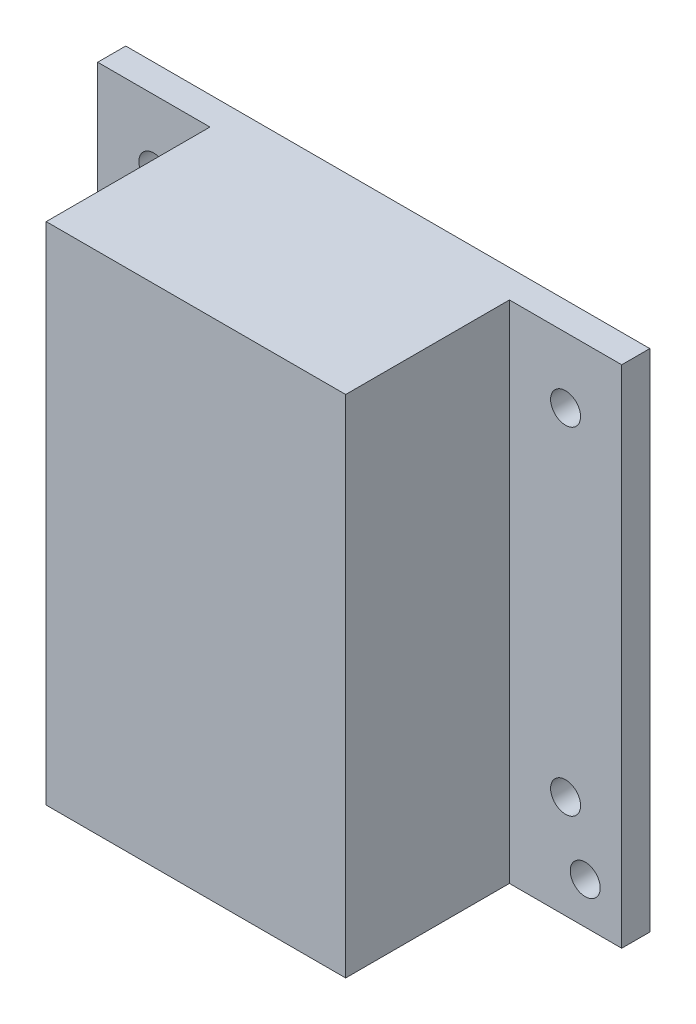
ISO-10303-21;
HEADER;
FILE_DESCRIPTION(('STEP AP214'),'2;1');
FILE_NAME('part.step','',(''),(''),'','','');
FILE_SCHEMA(('AUTOMOTIVE_DESIGN { 1 0 10303 214 1 1 1 1 }'));
ENDSEC;
DATA;
#1=APPLICATION_CONTEXT('core data for automotive mechanical design processes');
#2=APPLICATION_PROTOCOL_DEFINITION('international standard','automotive_design',2000,#1);
#3=PRODUCT_CONTEXT('',#1,'mechanical');
#4=PRODUCT('Part','Part','',(#3));
#5=PRODUCT_RELATED_PRODUCT_CATEGORY('part','',(#4));
#6=PRODUCT_DEFINITION_FORMATION('','',#4);
#7=PRODUCT_DEFINITION_CONTEXT('part definition',#1,'design');
#8=PRODUCT_DEFINITION('design','',#6,#7);
#9=PRODUCT_DEFINITION_SHAPE('','',#8);
#10=(LENGTH_UNIT() NAMED_UNIT(*) SI_UNIT(.MILLI.,.METRE.));
#11=(NAMED_UNIT(*) PLANE_ANGLE_UNIT() SI_UNIT($,.RADIAN.));
#12=(NAMED_UNIT(*) SI_UNIT($,.STERADIAN.) SOLID_ANGLE_UNIT());
#13=UNCERTAINTY_MEASURE_WITH_UNIT(LENGTH_MEASURE(1.E-05),#10,'distance_accuracy_value','');
#14=(GEOMETRIC_REPRESENTATION_CONTEXT(3) GLOBAL_UNCERTAINTY_ASSIGNED_CONTEXT((#13)) GLOBAL_UNIT_ASSIGNED_CONTEXT((#10,
#11,#12)) REPRESENTATION_CONTEXT('',''));
#15=CARTESIAN_POINT('',(0.,0.,0.));
#16=DIRECTION('',(0.,0.,1.));
#17=DIRECTION('',(1.,0.,0.));
#18=AXIS2_PLACEMENT_3D('',#15,#16,#17);
#19=CARTESIAN_POINT('',(16.,-80.,23.5));
#20=DIRECTION('',(-1.,0.,0.));
#21=DIRECTION('',(0.,0.,1.));
#22=AXIS2_PLACEMENT_3D('',#19,#20,#21);
#23=PLANE('',#22);
#24=DIRECTION('',(0.,0.,-1.));
#25=VECTOR('',#24,1.);
#26=CARTESIAN_POINT('',(16.,-80.,23.5));
#27=LINE('',#26,#25);
#28=CARTESIAN_POINT('',(16.,-80.,26.5));
#29=VERTEX_POINT('',#28);
#30=CARTESIAN_POINT('',(16.,-80.,9.));
#31=VERTEX_POINT('',#30);
#32=EDGE_CURVE('E231',#29,#31,#27,.T.);
#33=ORIENTED_EDGE('',*,*,#32,.T.);
#34=DIRECTION('',(0.,-1.,0.));
#35=VECTOR('',#34,1.);
#36=CARTESIAN_POINT('',(16.,-26.,9.));
#37=LINE('',#36,#35);
#38=CARTESIAN_POINT('',(16.,-26.,9.));
#39=VERTEX_POINT('',#38);
#40=EDGE_CURVE('E143',#39,#31,#37,.T.);
#41=ORIENTED_EDGE('',*,*,#40,.F.);
#42=DIRECTION('',(0.,0.,-1.));
#43=VECTOR('',#42,1.);
#44=CARTESIAN_POINT('',(16.,-26.,23.5));
#45=LINE('',#44,#43);
#46=CARTESIAN_POINT('',(16.,-26.,26.5));
#47=VERTEX_POINT('',#46);
#48=EDGE_CURVE('E111',#47,#39,#45,.T.);
#49=ORIENTED_EDGE('',*,*,#48,.F.);
#50=DIRECTION('',(0.,1.,0.));
#51=VECTOR('',#50,1.);
#52=CARTESIAN_POINT('',(16.,-26.,26.5));
#53=LINE('',#52,#51);
#54=EDGE_CURVE('E306',#29,#47,#53,.T.);
#55=ORIENTED_EDGE('',*,*,#54,.F.);
#56=EDGE_LOOP('',(#33,#41,#49,#55));
#57=FACE_BOUND('',#56,.T.);
#58=ADVANCED_FACE('F32',(#57),#23,.F.);
#59=CARTESIAN_POINT('',(0.,0.,26.5));
#60=DIRECTION('',(0.,0.,1.));
#61=DIRECTION('',(1.,0.,0.));
#62=AXIS2_PLACEMENT_3D('',#59,#60,#61);
#63=PLANE('',#62);
#64=DIRECTION('',(0.,-1.,0.));
#65=VECTOR('',#64,1.);
#66=CARTESIAN_POINT('',(-16.,-26.,26.5));
#67=LINE('',#66,#65);
#68=CARTESIAN_POINT('',(-16.,-26.,26.5));
#69=VERTEX_POINT('',#68);
#70=CARTESIAN_POINT('',(-16.,-80.,26.5));
#71=VERTEX_POINT('',#70);
#72=EDGE_CURVE('E234',#69,#71,#67,.T.);
#73=ORIENTED_EDGE('',*,*,#72,.T.);
#74=DIRECTION('',(1.,0.,0.));
#75=VECTOR('',#74,1.);
#76=CARTESIAN_POINT('',(-16.,-80.,26.5));
#77=LINE('',#76,#75);
#78=EDGE_CURVE('E221',#71,#29,#77,.T.);
#79=ORIENTED_EDGE('',*,*,#78,.T.);
#80=ORIENTED_EDGE('',*,*,#54,.T.);
#81=DIRECTION('',(-1.,0.,0.));
#82=VECTOR('',#81,1.);
#83=CARTESIAN_POINT('',(-16.,-26.,26.5));
#84=LINE('',#83,#82);
#85=EDGE_CURVE('E240',#47,#69,#84,.T.);
#86=ORIENTED_EDGE('',*,*,#85,.T.);
#87=EDGE_LOOP('',(#73,#79,#80,#86));
#88=FACE_BOUND('',#87,.T.);
#89=ADVANCED_FACE('F378',(#88),#63,.T.);
#90=CARTESIAN_POINT('',(-16.,-80.,23.5));
#91=DIRECTION('',(1.,0.,0.));
#92=DIRECTION('',(0.,0.,-1.));
#93=AXIS2_PLACEMENT_3D('',#90,#91,#92);
#94=PLANE('',#93);
#95=DIRECTION('',(0.,1.,0.));
#96=VECTOR('',#95,1.);
#97=CARTESIAN_POINT('',(-16.,-26.,9.));
#98=LINE('',#97,#96);
#99=CARTESIAN_POINT('',(-16.,-80.,9.));
#100=VERTEX_POINT('',#99);
#101=CARTESIAN_POINT('',(-16.,-26.,9.));
#102=VERTEX_POINT('',#101);
#103=EDGE_CURVE('E124',#100,#102,#98,.T.);
#104=ORIENTED_EDGE('',*,*,#103,.F.);
#105=DIRECTION('',(0.,0.,-1.));
#106=VECTOR('',#105,1.);
#107=CARTESIAN_POINT('',(-16.,-80.,23.5));
#108=LINE('',#107,#106);
#109=EDGE_CURVE('E164',#71,#100,#108,.T.);
#110=ORIENTED_EDGE('',*,*,#109,.F.);
#111=ORIENTED_EDGE('',*,*,#72,.F.);
#112=DIRECTION('',(0.,0.,-1.));
#113=VECTOR('',#112,1.);
#114=CARTESIAN_POINT('',(-16.,-26.,23.5));
#115=LINE('',#114,#113);
#116=EDGE_CURVE('E216',#69,#102,#115,.T.);
#117=ORIENTED_EDGE('',*,*,#116,.T.);
#118=EDGE_LOOP('',(#104,#110,#111,#117));
#119=FACE_BOUND('',#118,.T.);
#120=ADVANCED_FACE('F212',(#119),#94,.F.);
#121=CARTESIAN_POINT('',(12.5,-77.,23.));
#122=DIRECTION('',(0.,0.,1.));
#123=DIRECTION('',(1.,0.,0.));
#124=AXIS2_PLACEMENT_3D('',#121,#122,#123);
#125=PLANE('',#124);
#126=DIRECTION('',(-1.,0.,0.));
#127=VECTOR('',#126,1.);
#128=CARTESIAN_POINT('',(12.5,-80.,23.));
#129=LINE('',#128,#127);
#130=CARTESIAN_POINT('',(12.5,-80.,23.));
#131=VERTEX_POINT('',#130);
#132=CARTESIAN_POINT('',(-12.5,-80.,23.));
#133=VERTEX_POINT('',#132);
#134=EDGE_CURVE('E239',#131,#133,#129,.T.);
#135=ORIENTED_EDGE('',*,*,#134,.T.);
#136=DIRECTION('',(0.,-1.,0.));
#137=VECTOR('',#136,1.);
#138=CARTESIAN_POINT('',(-12.5,-77.,23.));
#139=LINE('',#138,#137);
#140=CARTESIAN_POINT('',(-12.5,-77.,23.));
#141=VERTEX_POINT('',#140);
#142=EDGE_CURVE('E311',#141,#133,#139,.T.);
#143=ORIENTED_EDGE('',*,*,#142,.F.);
#144=DIRECTION('',(-1.,0.,0.));
#145=VECTOR('',#144,1.);
#146=CARTESIAN_POINT('',(12.5,-77.,23.));
#147=LINE('',#146,#145);
#148=CARTESIAN_POINT('',(12.5,-77.,23.));
#149=VERTEX_POINT('',#148);
#150=EDGE_CURVE('E321',#149,#141,#147,.T.);
#151=ORIENTED_EDGE('',*,*,#150,.F.);
#152=DIRECTION('',(0.,-1.,0.));
#153=VECTOR('',#152,1.);
#154=CARTESIAN_POINT('',(12.5,-77.,23.));
#155=LINE('',#154,#153);
#156=EDGE_CURVE('E297',#149,#131,#155,.T.);
#157=ORIENTED_EDGE('',*,*,#156,.T.);
#158=EDGE_LOOP('',(#135,#143,#151,#157));
#159=FACE_BOUND('',#158,.T.);
#160=ADVANCED_FACE('F345',(#159),#125,.F.);
#161=CARTESIAN_POINT('',(0.,0.,23.5));
#162=DIRECTION('',(0.,0.,1.));
#163=DIRECTION('',(1.,0.,0.));
#164=AXIS2_PLACEMENT_3D('',#161,#162,#163);
#165=PLANE('',#164);
#166=DIRECTION('',(0.,-1.,0.));
#167=VECTOR('',#166,1.);
#168=CARTESIAN_POINT('',(-13.,-77.,23.5));
#169=LINE('',#168,#167);
#170=CARTESIAN_POINT('',(-13.,-29.,23.5));
#171=VERTEX_POINT('',#170);
#172=CARTESIAN_POINT('',(-13.,-77.,23.5));
#173=VERTEX_POINT('',#172);
#174=EDGE_CURVE('E246',#171,#173,#169,.T.);
#175=ORIENTED_EDGE('',*,*,#174,.F.);
#176=DIRECTION('',(-1.,0.,0.));
#177=VECTOR('',#176,1.);
#178=CARTESIAN_POINT('',(-13.,-29.,23.5));
#179=LINE('',#178,#177);
#180=CARTESIAN_POINT('',(13.,-29.,23.5));
#181=VERTEX_POINT('',#180);
#182=EDGE_CURVE('E255',#181,#171,#179,.T.);
#183=ORIENTED_EDGE('',*,*,#182,.F.);
#184=DIRECTION('',(0.,1.,0.));
#185=VECTOR('',#184,1.);
#186=CARTESIAN_POINT('',(13.,-77.,23.5));
#187=LINE('',#186,#185);
#188=CARTESIAN_POINT('',(13.,-77.,23.5));
#189=VERTEX_POINT('',#188);
#190=EDGE_CURVE('E245',#189,#181,#187,.T.);
#191=ORIENTED_EDGE('',*,*,#190,.F.);
#192=DIRECTION('',(1.,0.,0.));
#193=VECTOR('',#192,1.);
#194=CARTESIAN_POINT('',(-13.,-77.,23.5));
#195=LINE('',#194,#193);
#196=EDGE_CURVE('E251',#173,#189,#195,.T.);
#197=ORIENTED_EDGE('',*,*,#196,.F.);
#198=EDGE_LOOP('',(#175,#183,#191,#197));
#199=FACE_BOUND('',#198,.T.);
#200=ADVANCED_FACE('F387',(#199),#165,.F.);
#201=CARTESIAN_POINT('',(-13.,-77.,23.5));
#202=DIRECTION('',(1.,0.,0.));
#203=DIRECTION('',(0.,0.,-1.));
#204=AXIS2_PLACEMENT_3D('',#201,#202,#203);
#205=PLANE('',#204);
#206=DIRECTION('',(0.,-1.,0.));
#207=VECTOR('',#206,1.);
#208=CARTESIAN_POINT('',(-13.,-77.,6.));
#209=LINE('',#208,#207);
#210=CARTESIAN_POINT('',(-13.,-29.,6.));
#211=VERTEX_POINT('',#210);
#212=CARTESIAN_POINT('',(-13.,-77.,6.));
#213=VERTEX_POINT('',#212);
#214=EDGE_CURVE('E262',#211,#213,#209,.T.);
#215=ORIENTED_EDGE('',*,*,#214,.F.);
#216=DIRECTION('',(0.,0.,-1.));
#217=VECTOR('',#216,1.);
#218=CARTESIAN_POINT('',(-13.,-29.,23.5));
#219=LINE('',#218,#217);
#220=EDGE_CURVE('E256',#171,#211,#219,.T.);
#221=ORIENTED_EDGE('',*,*,#220,.F.);
#222=ORIENTED_EDGE('',*,*,#174,.T.);
#223=DIRECTION('',(0.,0.,-1.));
#224=VECTOR('',#223,1.);
#225=CARTESIAN_POINT('',(-13.,-77.,23.5));
#226=LINE('',#225,#224);
#227=EDGE_CURVE('E242',#173,#213,#226,.T.);
#228=ORIENTED_EDGE('',*,*,#227,.T.);
#229=EDGE_LOOP('',(#215,#221,#222,#228));
#230=FACE_BOUND('',#229,.T.);
#231=ADVANCED_FACE('F288',(#230),#205,.T.);
#232=CARTESIAN_POINT('',(13.,-77.,23.5));
#233=DIRECTION('',(-1.,0.,0.));
#234=DIRECTION('',(0.,0.,1.));
#235=AXIS2_PLACEMENT_3D('',#232,#233,#234);
#236=PLANE('',#235);
#237=DIRECTION('',(0.,1.,0.));
#238=VECTOR('',#237,1.);
#239=CARTESIAN_POINT('',(13.,-77.,6.));
#240=LINE('',#239,#238);
#241=CARTESIAN_POINT('',(13.,-77.,6.));
#242=VERTEX_POINT('',#241);
#243=CARTESIAN_POINT('',(13.,-29.,6.));
#244=VERTEX_POINT('',#243);
#245=EDGE_CURVE('E263',#242,#244,#240,.T.);
#246=ORIENTED_EDGE('',*,*,#245,.F.);
#247=DIRECTION('',(0.,0.,-1.));
#248=VECTOR('',#247,1.);
#249=CARTESIAN_POINT('',(13.,-77.,23.5));
#250=LINE('',#249,#248);
#251=EDGE_CURVE('E247',#189,#242,#250,.T.);
#252=ORIENTED_EDGE('',*,*,#251,.F.);
#253=ORIENTED_EDGE('',*,*,#190,.T.);
#254=DIRECTION('',(0.,0.,-1.));
#255=VECTOR('',#254,1.);
#256=CARTESIAN_POINT('',(13.,-29.,23.5));
#257=LINE('',#256,#255);
#258=EDGE_CURVE('E252',#181,#244,#257,.T.);
#259=ORIENTED_EDGE('',*,*,#258,.T.);
#260=EDGE_LOOP('',(#246,#252,#253,#259));
#261=FACE_BOUND('',#260,.T.);
#262=ADVANCED_FACE('F392',(#261),#236,.T.);
#263=CARTESIAN_POINT('',(-13.,-29.,23.5));
#264=DIRECTION('',(0.,-1.,0.));
#265=DIRECTION('',(0.,0.,-1.));
#266=AXIS2_PLACEMENT_3D('',#263,#264,#265);
#267=PLANE('',#266);
#268=DIRECTION('',(-1.,0.,0.));
#269=VECTOR('',#268,1.);
#270=CARTESIAN_POINT('',(-13.,-29.,6.));
#271=LINE('',#270,#269);
#272=EDGE_CURVE('E260',#244,#211,#271,.T.);
#273=ORIENTED_EDGE('',*,*,#272,.F.);
#274=ORIENTED_EDGE('',*,*,#258,.F.);
#275=ORIENTED_EDGE('',*,*,#182,.T.);
#276=ORIENTED_EDGE('',*,*,#220,.T.);
#277=EDGE_LOOP('',(#273,#274,#275,#276));
#278=FACE_BOUND('',#277,.T.);
#279=ADVANCED_FACE('F433',(#278),#267,.T.);
#280=CARTESIAN_POINT('',(-13.,-77.,23.5));
#281=DIRECTION('',(0.,1.,0.));
#282=DIRECTION('',(0.,0.,1.));
#283=AXIS2_PLACEMENT_3D('',#280,#281,#282);
#284=PLANE('',#283);
#285=DIRECTION('',(1.,0.,0.));
#286=VECTOR('',#285,1.);
#287=CARTESIAN_POINT('',(-13.,-77.,6.));
#288=LINE('',#287,#286);
#289=CARTESIAN_POINT('',(12.5,-77.,6.));
#290=VERTEX_POINT('',#289);
#291=EDGE_CURVE('E265',#290,#242,#288,.T.);
#292=ORIENTED_EDGE('',*,*,#291,.F.);
#293=DIRECTION('',(0.,0.,1.));
#294=VECTOR('',#293,1.);
#295=CARTESIAN_POINT('',(12.5,-77.,6.));
#296=LINE('',#295,#294);
#297=EDGE_CURVE('E259',#290,#149,#296,.T.);
#298=ORIENTED_EDGE('',*,*,#297,.T.);
#299=ORIENTED_EDGE('',*,*,#150,.T.);
#300=DIRECTION('',(0.,0.,-1.));
#301=VECTOR('',#300,1.);
#302=CARTESIAN_POINT('',(-12.5,-77.,23.));
#303=LINE('',#302,#301);
#304=CARTESIAN_POINT('',(-12.5,-77.,6.));
#305=VERTEX_POINT('',#304);
#306=EDGE_CURVE('E286',#141,#305,#303,.T.);
#307=ORIENTED_EDGE('',*,*,#306,.T.);
#308=EDGE_CURVE('E42',#213,#305,#288,.T.);
#309=ORIENTED_EDGE('',*,*,#308,.F.);
#310=ORIENTED_EDGE('',*,*,#227,.F.);
#311=ORIENTED_EDGE('',*,*,#196,.T.);
#312=ORIENTED_EDGE('',*,*,#251,.T.);
#313=EDGE_LOOP('',(#292,#298,#299,#307,#309,#310,#311,#312));
#314=FACE_BOUND('',#313,.T.);
#315=ADVANCED_FACE('F281',(#314),#284,.T.);
#316=CARTESIAN_POINT('',(-12.5,-77.,23.));
#317=DIRECTION('',(-1.,0.,0.));
#318=DIRECTION('',(0.,0.,1.));
#319=AXIS2_PLACEMENT_3D('',#316,#317,#318);
#320=PLANE('',#319);
#321=DIRECTION('',(0.,0.,-1.));
#322=VECTOR('',#321,1.);
#323=CARTESIAN_POINT('',(-12.5,-80.,23.));
#324=LINE('',#323,#322);
#325=CARTESIAN_POINT('',(-12.5,-80.,6.));
#326=VERTEX_POINT('',#325);
#327=EDGE_CURVE('E250',#133,#326,#324,.T.);
#328=ORIENTED_EDGE('',*,*,#327,.T.);
#329=DIRECTION('',(0.,-1.,0.));
#330=VECTOR('',#329,1.);
#331=CARTESIAN_POINT('',(-12.5,-77.,6.));
#332=LINE('',#331,#330);
#333=EDGE_CURVE('E11',#305,#326,#332,.T.);
#334=ORIENTED_EDGE('',*,*,#333,.F.);
#335=ORIENTED_EDGE('',*,*,#306,.F.);
#336=ORIENTED_EDGE('',*,*,#142,.T.);
#337=EDGE_LOOP('',(#328,#334,#335,#336));
#338=FACE_BOUND('',#337,.T.);
#339=ADVANCED_FACE('F432',(#338),#320,.F.);
#340=CARTESIAN_POINT('',(12.5,-77.,6.));
#341=DIRECTION('',(1.,0.,0.));
#342=DIRECTION('',(0.,0.,-1.));
#343=AXIS2_PLACEMENT_3D('',#340,#341,#342);
#344=PLANE('',#343);
#345=DIRECTION('',(0.,0.,1.));
#346=VECTOR('',#345,1.);
#347=CARTESIAN_POINT('',(12.5,-80.,6.));
#348=LINE('',#347,#346);
#349=CARTESIAN_POINT('',(12.5,-80.,6.));
#350=VERTEX_POINT('',#349);
#351=EDGE_CURVE('E314',#350,#131,#348,.T.);
#352=ORIENTED_EDGE('',*,*,#351,.T.);
#353=ORIENTED_EDGE('',*,*,#156,.F.);
#354=ORIENTED_EDGE('',*,*,#297,.F.);
#355=DIRECTION('',(0.,-1.,0.));
#356=VECTOR('',#355,1.);
#357=CARTESIAN_POINT('',(12.5,-77.,6.));
#358=LINE('',#357,#356);
#359=EDGE_CURVE('E51',#290,#350,#358,.T.);
#360=ORIENTED_EDGE('',*,*,#359,.T.);
#361=EDGE_LOOP('',(#352,#353,#354,#360));
#362=FACE_BOUND('',#361,.T.);
#363=ADVANCED_FACE('F335',(#362),#344,.F.);
#364=CARTESIAN_POINT('',(28.,-26.,9.));
#365=DIRECTION('',(-1.,0.,0.));
#366=DIRECTION('',(0.,-1.,0.));
#367=AXIS2_PLACEMENT_3D('',#364,#365,#366);
#368=PLANE('',#367);
#369=DIRECTION('',(0.,1.,0.));
#370=VECTOR('',#369,1.);
#371=CARTESIAN_POINT('',(28.,-26.,6.));
#372=LINE('',#371,#370);
#373=CARTESIAN_POINT('',(28.,-80.,6.));
#374=VERTEX_POINT('',#373);
#375=CARTESIAN_POINT('',(28.,-26.,6.));
#376=VERTEX_POINT('',#375);
#377=EDGE_CURVE('E129',#374,#376,#372,.T.);
#378=ORIENTED_EDGE('',*,*,#377,.T.);
#379=DIRECTION('',(0.,0.,-1.));
#380=VECTOR('',#379,1.);
#381=CARTESIAN_POINT('',(28.,-26.,9.));
#382=LINE('',#381,#380);
#383=CARTESIAN_POINT('',(28.,-26.,9.));
#384=VERTEX_POINT('',#383);
#385=EDGE_CURVE('E108',#384,#376,#382,.T.);
#386=ORIENTED_EDGE('',*,*,#385,.F.);
#387=DIRECTION('',(0.,1.,0.));
#388=VECTOR('',#387,1.);
#389=CARTESIAN_POINT('',(28.,-26.,9.));
#390=LINE('',#389,#388);
#391=CARTESIAN_POINT('',(28.,-80.,9.));
#392=VERTEX_POINT('',#391);
#393=EDGE_CURVE('E137',#392,#384,#390,.T.);
#394=ORIENTED_EDGE('',*,*,#393,.F.);
#395=DIRECTION('',(0.,0.,-1.));
#396=VECTOR('',#395,1.);
#397=CARTESIAN_POINT('',(28.,-80.,9.));
#398=LINE('',#397,#396);
#399=EDGE_CURVE('E103',#392,#374,#398,.T.);
#400=ORIENTED_EDGE('',*,*,#399,.T.);
#401=EDGE_LOOP('',(#378,#386,#394,#400));
#402=FACE_BOUND('',#401,.T.);
#403=ADVANCED_FACE('F369',(#402),#368,.F.);
#404=CARTESIAN_POINT('',(-28.,-26.,9.));
#405=DIRECTION('',(1.,0.,0.));
#406=DIRECTION('',(0.,1.,0.));
#407=AXIS2_PLACEMENT_3D('',#404,#405,#406);
#408=PLANE('',#407);
#409=DIRECTION('',(0.,-1.,0.));
#410=VECTOR('',#409,1.);
#411=CARTESIAN_POINT('',(-28.,-26.,6.));
#412=LINE('',#411,#410);
#413=CARTESIAN_POINT('',(-28.,-26.,6.));
#414=VERTEX_POINT('',#413);
#415=CARTESIAN_POINT('',(-28.,-80.,6.));
#416=VERTEX_POINT('',#415);
#417=EDGE_CURVE('E87',#414,#416,#412,.T.);
#418=ORIENTED_EDGE('',*,*,#417,.T.);
#419=DIRECTION('',(0.,0.,-1.));
#420=VECTOR('',#419,1.);
#421=CARTESIAN_POINT('',(-28.,-80.,9.));
#422=LINE('',#421,#420);
#423=CARTESIAN_POINT('',(-28.,-80.,9.));
#424=VERTEX_POINT('',#423);
#425=EDGE_CURVE('E93',#424,#416,#422,.T.);
#426=ORIENTED_EDGE('',*,*,#425,.F.);
#427=DIRECTION('',(0.,-1.,0.));
#428=VECTOR('',#427,1.);
#429=CARTESIAN_POINT('',(-28.,-26.,9.));
#430=LINE('',#429,#428);
#431=CARTESIAN_POINT('',(-28.,-26.,9.));
#432=VERTEX_POINT('',#431);
#433=EDGE_CURVE('E118',#432,#424,#430,.T.);
#434=ORIENTED_EDGE('',*,*,#433,.F.);
#435=DIRECTION('',(0.,0.,-1.));
#436=VECTOR('',#435,1.);
#437=CARTESIAN_POINT('',(-28.,-26.,9.));
#438=LINE('',#437,#436);
#439=EDGE_CURVE('E102',#432,#414,#438,.T.);
#440=ORIENTED_EDGE('',*,*,#439,.T.);
#441=EDGE_LOOP('',(#418,#426,#434,#440));
#442=FACE_BOUND('',#441,.T.);
#443=ADVANCED_FACE('F97',(#442),#408,.F.);
#444=CARTESIAN_POINT('',(-16.,-26.,23.5));
#445=DIRECTION('',(0.,-1.,0.));
#446=DIRECTION('',(1.,0.,0.));
#447=AXIS2_PLACEMENT_3D('',#444,#445,#446);
#448=PLANE('',#447);
#449=DIRECTION('',(-1.,0.,0.));
#450=VECTOR('',#449,1.);
#451=CARTESIAN_POINT('',(-16.,-26.,6.));
#452=LINE('',#451,#450);
#453=EDGE_CURVE('E237',#376,#414,#452,.T.);
#454=ORIENTED_EDGE('',*,*,#453,.T.);
#455=ORIENTED_EDGE('',*,*,#439,.F.);
#456=DIRECTION('',(-1.,0.,0.));
#457=VECTOR('',#456,1.);
#458=CARTESIAN_POINT('',(-16.,-26.,9.));
#459=LINE('',#458,#457);
#460=EDGE_CURVE('E121',#102,#432,#459,.T.);
#461=ORIENTED_EDGE('',*,*,#460,.F.);
#462=ORIENTED_EDGE('',*,*,#116,.F.);
#463=ORIENTED_EDGE('',*,*,#85,.F.);
#464=ORIENTED_EDGE('',*,*,#48,.T.);
#465=DIRECTION('',(-1.,0.,0.));
#466=VECTOR('',#465,1.);
#467=CARTESIAN_POINT('',(16.,-26.,9.));
#468=LINE('',#467,#466);
#469=EDGE_CURVE('E133',#384,#39,#468,.T.);
#470=ORIENTED_EDGE('',*,*,#469,.F.);
#471=ORIENTED_EDGE('',*,*,#385,.T.);
#472=EDGE_LOOP('',(#454,#455,#461,#462,#463,#464,#470,#471));
#473=FACE_BOUND('',#472,.T.);
#474=ADVANCED_FACE('F372',(#473),#448,.F.);
#475=CARTESIAN_POINT('',(-66.,-80.,6.));
#476=DIRECTION('',(0.,1.,0.));
#477=DIRECTION('',(0.,0.,1.));
#478=AXIS2_PLACEMENT_3D('',#475,#476,#477);
#479=PLANE('',#478);
#480=ORIENTED_EDGE('',*,*,#425,.T.);
#481=DIRECTION('',(1.,0.,0.));
#482=VECTOR('',#481,1.);
#483=CARTESIAN_POINT('',(-58.88,-80.,6.));
#484=LINE('',#483,#482);
#485=EDGE_CURVE('E83',#416,#326,#484,.T.);
#486=ORIENTED_EDGE('',*,*,#485,.T.);
#487=ORIENTED_EDGE('',*,*,#327,.F.);
#488=ORIENTED_EDGE('',*,*,#134,.F.);
#489=ORIENTED_EDGE('',*,*,#351,.F.);
#490=EDGE_CURVE('E36',#350,#374,#484,.T.);
#491=ORIENTED_EDGE('',*,*,#490,.T.);
#492=ORIENTED_EDGE('',*,*,#399,.F.);
#493=DIRECTION('',(1.,0.,0.));
#494=VECTOR('',#493,1.);
#495=CARTESIAN_POINT('',(16.,-80.,9.));
#496=LINE('',#495,#494);
#497=EDGE_CURVE('E140',#31,#392,#496,.T.);
#498=ORIENTED_EDGE('',*,*,#497,.F.);
#499=ORIENTED_EDGE('',*,*,#32,.F.);
#500=ORIENTED_EDGE('',*,*,#78,.F.);
#501=ORIENTED_EDGE('',*,*,#109,.T.);
#502=DIRECTION('',(1.,0.,0.));
#503=VECTOR('',#502,1.);
#504=CARTESIAN_POINT('',(-16.,-80.,9.));
#505=LINE('',#504,#503);
#506=EDGE_CURVE('E107',#424,#100,#505,.T.);
#507=ORIENTED_EDGE('',*,*,#506,.F.);
#508=EDGE_LOOP('',(#480,#486,#487,#488,#489,#491,#492,#498,#499,#500,#501,#507));
#509=FACE_BOUND('',#508,.T.);
#510=ADVANCED_FACE('F34',(#509),#479,.F.);
#511=CARTESIAN_POINT('',(-22.,-69.,0.));
#512=DIRECTION('',(0.,0.,1.));
#513=DIRECTION('',(1.,0.,0.));
#514=AXIS2_PLACEMENT_3D('',#511,#512,#513);
#515=CYLINDRICAL_SURFACE('',#514,1.60000000000001);
#516=CARTESIAN_POINT('',(-22.,-69.,6.));
#517=DIRECTION('',(0.,0.,1.));
#518=DIRECTION('',(1.,0.,0.));
#519=AXIS2_PLACEMENT_3D('',#516,#517,#518);
#520=CIRCLE('',#519,1.60000000000001);
#521=CARTESIAN_POINT('',(-20.4,-69.,6.));
#522=VERTEX_POINT('',#521);
#523=EDGE_CURVE('E151',#522,#522,#520,.F.);
#524=ORIENTED_EDGE('',*,*,#523,.T.);
#525=EDGE_LOOP('',(#524));
#526=FACE_BOUND('',#525,.T.);
#527=CARTESIAN_POINT('',(-22.,-69.,9.));
#528=DIRECTION('',(0.,0.,1.));
#529=DIRECTION('',(1.,0.,0.));
#530=AXIS2_PLACEMENT_3D('',#527,#528,#529);
#531=CIRCLE('',#530,1.60000000000001);
#532=CARTESIAN_POINT('',(-20.4,-69.,9.));
#533=VERTEX_POINT('',#532);
#534=EDGE_CURVE('E147',#533,#533,#531,.T.);
#535=ORIENTED_EDGE('',*,*,#534,.T.);
#536=EDGE_LOOP('',(#535));
#537=FACE_BOUND('',#536,.T.);
#538=ADVANCED_FACE('F189',(#526,#537),#515,.F.);
#539=CARTESIAN_POINT('',(-22.,-33.,0.));
#540=DIRECTION('',(0.,0.,1.));
#541=DIRECTION('',(1.,0.,0.));
#542=AXIS2_PLACEMENT_3D('',#539,#540,#541);
#543=CYLINDRICAL_SURFACE('',#542,1.6);
#544=CARTESIAN_POINT('',(-22.,-33.,6.));
#545=DIRECTION('',(0.,0.,1.));
#546=DIRECTION('',(1.,0.,0.));
#547=AXIS2_PLACEMENT_3D('',#544,#545,#546);
#548=CIRCLE('',#547,1.6);
#549=CARTESIAN_POINT('',(-20.4,-33.,6.));
#550=VERTEX_POINT('',#549);
#551=EDGE_CURVE('E150',#550,#550,#548,.F.);
#552=ORIENTED_EDGE('',*,*,#551,.T.);
#553=EDGE_LOOP('',(#552));
#554=FACE_BOUND('',#553,.T.);
#555=CARTESIAN_POINT('',(-22.,-33.,9.));
#556=DIRECTION('',(0.,0.,1.));
#557=DIRECTION('',(1.,0.,0.));
#558=AXIS2_PLACEMENT_3D('',#555,#556,#557);
#559=CIRCLE('',#558,1.6);
#560=CARTESIAN_POINT('',(-20.4,-33.,9.));
#561=VERTEX_POINT('',#560);
#562=EDGE_CURVE('E152',#561,#561,#559,.T.);
#563=ORIENTED_EDGE('',*,*,#562,.T.);
#564=EDGE_LOOP('',(#563));
#565=FACE_BOUND('',#564,.T.);
#566=ADVANCED_FACE('F192',(#554,#565),#543,.F.);
#567=CARTESIAN_POINT('',(0.,0.,9.));
#568=DIRECTION('',(0.,0.,-1.));
#569=DIRECTION('',(-1.,0.,0.));
#570=AXIS2_PLACEMENT_3D('',#567,#568,#569);
#571=PLANE('',#570);
#572=CARTESIAN_POINT('',(-24.1,-75.5727497877005,9.));
#573=DIRECTION('',(0.,0.,-1.));
#574=DIRECTION('',(-1.,0.,0.));
#575=AXIS2_PLACEMENT_3D('',#572,#573,#574);
#576=CIRCLE('',#575,1.6);
#577=CARTESIAN_POINT('',(-25.7,-75.5727497877005,9.));
#578=VERTEX_POINT('',#577);
#579=EDGE_CURVE('E127',#578,#578,#576,.T.);
#580=ORIENTED_EDGE('',*,*,#579,.T.);
#581=EDGE_LOOP('',(#580));
#582=FACE_BOUND('',#581,.T.);
#583=ORIENTED_EDGE('',*,*,#562,.F.);
#584=EDGE_LOOP('',(#583));
#585=FACE_BOUND('',#584,.T.);
#586=ORIENTED_EDGE('',*,*,#534,.F.);
#587=EDGE_LOOP('',(#586));
#588=FACE_BOUND('',#587,.T.);
#589=ORIENTED_EDGE('',*,*,#103,.T.);
#590=ORIENTED_EDGE('',*,*,#460,.T.);
#591=ORIENTED_EDGE('',*,*,#433,.T.);
#592=ORIENTED_EDGE('',*,*,#506,.T.);
#593=EDGE_LOOP('',(#589,#590,#591,#592));
#594=FACE_BOUND('',#593,.T.);
#595=ADVANCED_FACE('F196',(#582,#585,#588,#594),#571,.F.);
#596=CARTESIAN_POINT('',(-24.1,-75.5727497877005,26.5));
#597=DIRECTION('',(0.,0.,-1.));
#598=DIRECTION('',(-1.,0.,0.));
#599=AXIS2_PLACEMENT_3D('',#596,#597,#598);
#600=CYLINDRICAL_SURFACE('',#599,1.6);
#601=CARTESIAN_POINT('',(-24.1,-75.5727497877005,6.));
#602=DIRECTION('',(0.,0.,1.));
#603=DIRECTION('',(1.,0.,0.));
#604=AXIS2_PLACEMENT_3D('',#601,#602,#603);
#605=CIRCLE('',#604,1.6);
#606=CARTESIAN_POINT('',(-22.5,-75.5727497877005,6.));
#607=VERTEX_POINT('',#606);
#608=EDGE_CURVE('E117',#607,#607,#605,.F.);
#609=ORIENTED_EDGE('',*,*,#608,.T.);
#610=EDGE_LOOP('',(#609));
#611=FACE_BOUND('',#610,.T.);
#612=ORIENTED_EDGE('',*,*,#579,.F.);
#613=EDGE_LOOP('',(#612));
#614=FACE_BOUND('',#613,.T.);
#615=ADVANCED_FACE('F176',(#611,#614),#600,.F.);
#616=CARTESIAN_POINT('',(22.,-69.,0.));
#617=DIRECTION('',(0.,0.,1.));
#618=DIRECTION('',(1.,0.,0.));
#619=AXIS2_PLACEMENT_3D('',#616,#617,#618);
#620=CYLINDRICAL_SURFACE('',#619,1.60000000000001);
#621=CARTESIAN_POINT('',(22.,-69.,6.));
#622=DIRECTION('',(0.,0.,1.));
#623=DIRECTION('',(1.,0.,0.));
#624=AXIS2_PLACEMENT_3D('',#621,#622,#623);
#625=CIRCLE('',#624,1.60000000000001);
#626=CARTESIAN_POINT('',(23.6,-69.,6.));
#627=VERTEX_POINT('',#626);
#628=EDGE_CURVE('E159',#627,#627,#625,.F.);
#629=ORIENTED_EDGE('',*,*,#628,.T.);
#630=EDGE_LOOP('',(#629));
#631=FACE_BOUND('',#630,.T.);
#632=CARTESIAN_POINT('',(22.,-69.,9.));
#633=DIRECTION('',(0.,0.,1.));
#634=DIRECTION('',(-1.,0.,0.));
#635=AXIS2_PLACEMENT_3D('',#632,#633,#634);
#636=CIRCLE('',#635,1.60000000000001);
#637=CARTESIAN_POINT('',(20.4,-69.,9.));
#638=VERTEX_POINT('',#637);
#639=EDGE_CURVE('E155',#638,#638,#636,.T.);
#640=ORIENTED_EDGE('',*,*,#639,.T.);
#641=EDGE_LOOP('',(#640));
#642=FACE_BOUND('',#641,.T.);
#643=ADVANCED_FACE('F405',(#631,#642),#620,.F.);
#644=CARTESIAN_POINT('',(22.,-33.,0.));
#645=DIRECTION('',(0.,0.,1.));
#646=DIRECTION('',(1.,0.,0.));
#647=AXIS2_PLACEMENT_3D('',#644,#645,#646);
#648=CYLINDRICAL_SURFACE('',#647,1.6);
#649=CARTESIAN_POINT('',(22.,-33.,6.));
#650=DIRECTION('',(0.,0.,1.));
#651=DIRECTION('',(1.,0.,0.));
#652=AXIS2_PLACEMENT_3D('',#649,#650,#651);
#653=CIRCLE('',#652,1.6);
#654=CARTESIAN_POINT('',(23.6,-33.,6.));
#655=VERTEX_POINT('',#654);
#656=EDGE_CURVE('E158',#655,#655,#653,.F.);
#657=ORIENTED_EDGE('',*,*,#656,.T.);
#658=EDGE_LOOP('',(#657));
#659=FACE_BOUND('',#658,.T.);
#660=CARTESIAN_POINT('',(22.,-33.,9.));
#661=DIRECTION('',(0.,0.,1.));
#662=DIRECTION('',(-1.,0.,0.));
#663=AXIS2_PLACEMENT_3D('',#660,#661,#662);
#664=CIRCLE('',#663,1.6);
#665=CARTESIAN_POINT('',(20.4,-33.,9.));
#666=VERTEX_POINT('',#665);
#667=EDGE_CURVE('E146',#666,#666,#664,.T.);
#668=ORIENTED_EDGE('',*,*,#667,.T.);
#669=EDGE_LOOP('',(#668));
#670=FACE_BOUND('',#669,.T.);
#671=ADVANCED_FACE('F399',(#659,#670),#648,.F.);
#672=CARTESIAN_POINT('',(0.,0.,9.));
#673=DIRECTION('',(0.,0.,1.));
#674=DIRECTION('',(1.,0.,0.));
#675=AXIS2_PLACEMENT_3D('',#672,#673,#674);
#676=PLANE('',#675);
#677=CARTESIAN_POINT('',(24.1,-75.5727497877005,9.));
#678=DIRECTION('',(0.,0.,1.));
#679=DIRECTION('',(1.,0.,0.));
#680=AXIS2_PLACEMENT_3D('',#677,#678,#679);
#681=CIRCLE('',#680,1.6);
#682=CARTESIAN_POINT('',(25.7,-75.5727497877005,9.));
#683=VERTEX_POINT('',#682);
#684=EDGE_CURVE('E172',#683,#683,#681,.T.);
#685=ORIENTED_EDGE('',*,*,#684,.F.);
#686=EDGE_LOOP('',(#685));
#687=FACE_BOUND('',#686,.T.);
#688=ORIENTED_EDGE('',*,*,#667,.F.);
#689=EDGE_LOOP('',(#688));
#690=FACE_BOUND('',#689,.T.);
#691=ORIENTED_EDGE('',*,*,#639,.F.);
#692=EDGE_LOOP('',(#691));
#693=FACE_BOUND('',#692,.T.);
#694=ORIENTED_EDGE('',*,*,#40,.T.);
#695=ORIENTED_EDGE('',*,*,#497,.T.);
#696=ORIENTED_EDGE('',*,*,#393,.T.);
#697=ORIENTED_EDGE('',*,*,#469,.T.);
#698=EDGE_LOOP('',(#694,#695,#696,#697));
#699=FACE_BOUND('',#698,.T.);
#700=ADVANCED_FACE('F364',(#687,#690,#693,#699),#676,.T.);
#701=CARTESIAN_POINT('',(24.1,-75.5727497877005,26.5));
#702=DIRECTION('',(0.,0.,-1.));
#703=DIRECTION('',(-1.,0.,0.));
#704=AXIS2_PLACEMENT_3D('',#701,#702,#703);
#705=CYLINDRICAL_SURFACE('',#704,1.6);
#706=CARTESIAN_POINT('',(24.1,-75.5727497877005,6.));
#707=DIRECTION('',(0.,0.,1.));
#708=DIRECTION('',(1.,0.,0.));
#709=AXIS2_PLACEMENT_3D('',#706,#707,#708);
#710=CIRCLE('',#709,1.6);
#711=CARTESIAN_POINT('',(25.7,-75.5727497877005,6.));
#712=VERTEX_POINT('',#711);
#713=EDGE_CURVE('E136',#712,#712,#710,.F.);
#714=ORIENTED_EDGE('',*,*,#713,.T.);
#715=EDGE_LOOP('',(#714));
#716=FACE_BOUND('',#715,.T.);
#717=ORIENTED_EDGE('',*,*,#684,.T.);
#718=EDGE_LOOP('',(#717));
#719=FACE_BOUND('',#718,.T.);
#720=ADVANCED_FACE('F181',(#716,#719),#705,.F.);
#721=CARTESIAN_POINT('',(0.,0.,6.));
#722=DIRECTION('',(0.,0.,1.));
#723=DIRECTION('',(1.,0.,0.));
#724=AXIS2_PLACEMENT_3D('',#721,#722,#723);
#725=PLANE('',#724);
#726=ORIENTED_EDGE('',*,*,#551,.F.);
#727=EDGE_LOOP('',(#726));
#728=FACE_BOUND('',#727,.T.);
#729=ORIENTED_EDGE('',*,*,#656,.F.);
#730=EDGE_LOOP('',(#729));
#731=FACE_BOUND('',#730,.T.);
#732=ORIENTED_EDGE('',*,*,#608,.F.);
#733=EDGE_LOOP('',(#732));
#734=FACE_BOUND('',#733,.T.);
#735=ORIENTED_EDGE('',*,*,#713,.F.);
#736=EDGE_LOOP('',(#735));
#737=FACE_BOUND('',#736,.T.);
#738=ORIENTED_EDGE('',*,*,#628,.F.);
#739=EDGE_LOOP('',(#738));
#740=FACE_BOUND('',#739,.T.);
#741=ORIENTED_EDGE('',*,*,#523,.F.);
#742=EDGE_LOOP('',(#741));
#743=FACE_BOUND('',#742,.T.);
#744=ORIENTED_EDGE('',*,*,#291,.T.);
#745=ORIENTED_EDGE('',*,*,#245,.T.);
#746=ORIENTED_EDGE('',*,*,#272,.T.);
#747=ORIENTED_EDGE('',*,*,#214,.T.);
#748=ORIENTED_EDGE('',*,*,#308,.T.);
#749=ORIENTED_EDGE('',*,*,#333,.T.);
#750=ORIENTED_EDGE('',*,*,#485,.F.);
#751=ORIENTED_EDGE('',*,*,#417,.F.);
#752=ORIENTED_EDGE('',*,*,#453,.F.);
#753=ORIENTED_EDGE('',*,*,#377,.F.);
#754=ORIENTED_EDGE('',*,*,#490,.F.);
#755=ORIENTED_EDGE('',*,*,#359,.F.);
#756=EDGE_LOOP('',(#744,#745,#746,#747,#748,#749,#750,#751,#752,#753,#754,#755));
#757=FACE_BOUND('',#756,.T.);
#758=ADVANCED_FACE('F85',(#728,#731,#734,#737,#740,#743,#757),#725,.F.);
#759=CLOSED_SHELL('',(#58,#89,#120,#160,#200,#231,#262,#279,#315,#339,#363,#403,#443,#474,#510,
#538,#566,#595,#615,#643,#671,#700,#720,#758));
#760=MANIFOLD_SOLID_BREP('B2',#759);
#761=ADVANCED_BREP_SHAPE_REPRESENTATION('',(#18,#760),#14);
#762=SHAPE_DEFINITION_REPRESENTATION(#9,#761);
ENDSEC;
END-ISO-10303-21;
